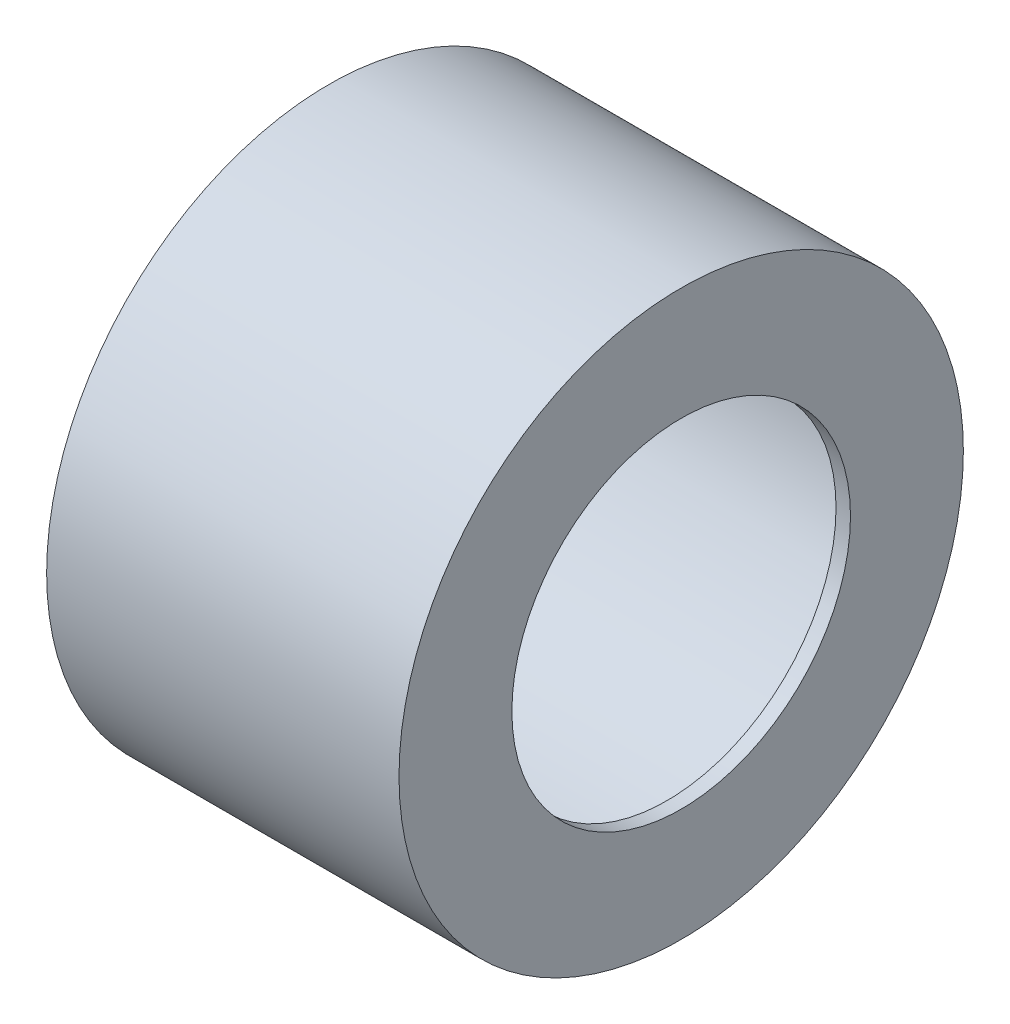
ISO-10303-21;
HEADER;
FILE_DESCRIPTION(('STEP AP214'),'2;1');
FILE_NAME('part.step','',(''),(''),'','','');
FILE_SCHEMA(('AUTOMOTIVE_DESIGN { 1 0 10303 214 1 1 1 1 }'));
ENDSEC;
DATA;
#1=APPLICATION_CONTEXT('core data for automotive mechanical design processes');
#2=APPLICATION_PROTOCOL_DEFINITION('international standard','automotive_design',2000,#1);
#3=PRODUCT_CONTEXT('',#1,'mechanical');
#4=PRODUCT('Part','Part','',(#3));
#5=PRODUCT_RELATED_PRODUCT_CATEGORY('part','',(#4));
#6=PRODUCT_DEFINITION_FORMATION('','',#4);
#7=PRODUCT_DEFINITION_CONTEXT('part definition',#1,'design');
#8=PRODUCT_DEFINITION('design','',#6,#7);
#9=PRODUCT_DEFINITION_SHAPE('','',#8);
#10=(LENGTH_UNIT() NAMED_UNIT(*) SI_UNIT(.MILLI.,.METRE.));
#11=(NAMED_UNIT(*) PLANE_ANGLE_UNIT() SI_UNIT($,.RADIAN.));
#12=(NAMED_UNIT(*) SI_UNIT($,.STERADIAN.) SOLID_ANGLE_UNIT());
#13=UNCERTAINTY_MEASURE_WITH_UNIT(LENGTH_MEASURE(1.E-05),#10,'distance_accuracy_value','');
#14=(GEOMETRIC_REPRESENTATION_CONTEXT(3) GLOBAL_UNCERTAINTY_ASSIGNED_CONTEXT((#13)) GLOBAL_UNIT_ASSIGNED_CONTEXT((#10,
#11,#12)) REPRESENTATION_CONTEXT('',''));
#15=CARTESIAN_POINT('',(0.,0.,0.));
#16=DIRECTION('',(0.,0.,1.));
#17=DIRECTION('',(1.,0.,0.));
#18=AXIS2_PLACEMENT_3D('',#15,#16,#17);
#19=CARTESIAN_POINT('',(135.7,39.,0.));
#20=DIRECTION('',(1.,0.,0.));
#21=DIRECTION('',(0.,0.,-1.));
#22=AXIS2_PLACEMENT_3D('',#19,#20,#21);
#23=PLANE('',#22);
#24=CARTESIAN_POINT('',(135.7,0.,0.));
#25=DIRECTION('',(-1.,0.,0.));
#26=DIRECTION('',(0.,0.,1.));
#27=AXIS2_PLACEMENT_3D('',#24,#25,#26);
#28=CIRCLE('',#27,36.4);
#29=CARTESIAN_POINT('',(135.7,0.,36.4));
#30=VERTEX_POINT('',#29);
#31=EDGE_CURVE('E10',#30,#30,#28,.T.);
#32=ORIENTED_EDGE('',*,*,#31,.F.);
#33=EDGE_LOOP('',(#32));
#34=FACE_BOUND('',#33,.T.);
#35=CARTESIAN_POINT('',(135.7,0.,0.));
#36=DIRECTION('',(-1.,0.,0.));
#37=DIRECTION('',(0.,0.,1.));
#38=AXIS2_PLACEMENT_3D('',#35,#36,#37);
#39=CIRCLE('',#38,39.);
#40=CARTESIAN_POINT('',(135.7,0.,39.));
#41=VERTEX_POINT('',#40);
#42=EDGE_CURVE('E64',#41,#41,#39,.T.);
#43=ORIENTED_EDGE('',*,*,#42,.T.);
#44=EDGE_LOOP('',(#43));
#45=FACE_BOUND('',#44,.T.);
#46=ADVANCED_FACE('F37',(#34,#45),#23,.F.);
#47=CARTESIAN_POINT('',(-110.,0.,0.));
#48=DIRECTION('',(-1.,0.,0.));
#49=DIRECTION('',(0.,0.,1.));
#50=AXIS2_PLACEMENT_3D('',#47,#48,#49);
#51=CYLINDRICAL_SURFACE('',#50,36.4);
#52=CARTESIAN_POINT('',(182.4,0.,0.));
#53=DIRECTION('',(-1.,0.,0.));
#54=DIRECTION('',(0.,0.,1.));
#55=AXIS2_PLACEMENT_3D('',#52,#53,#54);
#56=CIRCLE('',#55,36.4);
#57=CARTESIAN_POINT('',(182.4,0.,36.4));
#58=VERTEX_POINT('',#57);
#59=EDGE_CURVE('E44',#58,#58,#56,.T.);
#60=ORIENTED_EDGE('',*,*,#59,.F.);
#61=EDGE_LOOP('',(#60));
#62=FACE_BOUND('',#61,.T.);
#63=ORIENTED_EDGE('',*,*,#31,.T.);
#64=EDGE_LOOP('',(#63));
#65=FACE_BOUND('',#64,.T.);
#66=ADVANCED_FACE('F90',(#62,#65),#51,.F.);
#67=CARTESIAN_POINT('',(182.4,36.4,0.));
#68=DIRECTION('',(1.,0.,0.));
#69=DIRECTION('',(0.,0.,-1.));
#70=AXIS2_PLACEMENT_3D('',#67,#68,#69);
#71=PLANE('',#70);
#72=CARTESIAN_POINT('',(182.4,0.,0.));
#73=DIRECTION('',(-1.,0.,0.));
#74=DIRECTION('',(0.,0.,1.));
#75=AXIS2_PLACEMENT_3D('',#72,#73,#74);
#76=CIRCLE('',#75,23.4);
#77=CARTESIAN_POINT('',(182.4,0.,23.4));
#78=VERTEX_POINT('',#77);
#79=EDGE_CURVE('E49',#78,#78,#76,.T.);
#80=ORIENTED_EDGE('',*,*,#79,.F.);
#81=EDGE_LOOP('',(#80));
#82=FACE_BOUND('',#81,.T.);
#83=ORIENTED_EDGE('',*,*,#59,.T.);
#84=EDGE_LOOP('',(#83));
#85=FACE_BOUND('',#84,.T.);
#86=ADVANCED_FACE('F85',(#82,#85),#71,.F.);
#87=CARTESIAN_POINT('',(-110.,0.,0.));
#88=DIRECTION('',(-1.,0.,0.));
#89=DIRECTION('',(0.,0.,1.));
#90=AXIS2_PLACEMENT_3D('',#87,#88,#89);
#91=CYLINDRICAL_SURFACE('',#90,23.4);
#92=CARTESIAN_POINT('',(184.4,0.,0.));
#93=DIRECTION('',(-1.,0.,0.));
#94=DIRECTION('',(0.,0.,1.));
#95=AXIS2_PLACEMENT_3D('',#92,#93,#94);
#96=CIRCLE('',#95,23.4);
#97=CARTESIAN_POINT('',(184.4,0.,23.4));
#98=VERTEX_POINT('',#97);
#99=EDGE_CURVE('E54',#98,#98,#96,.T.);
#100=ORIENTED_EDGE('',*,*,#99,.F.);
#101=EDGE_LOOP('',(#100));
#102=FACE_BOUND('',#101,.T.);
#103=ORIENTED_EDGE('',*,*,#79,.T.);
#104=EDGE_LOOP('',(#103));
#105=FACE_BOUND('',#104,.T.);
#106=ADVANCED_FACE('F79',(#102,#105),#91,.F.);
#107=CARTESIAN_POINT('',(184.4,23.4,0.));
#108=DIRECTION('',(-1.,0.,0.));
#109=DIRECTION('',(0.,0.,1.));
#110=AXIS2_PLACEMENT_3D('',#107,#108,#109);
#111=PLANE('',#110);
#112=CARTESIAN_POINT('',(184.4,0.,0.));
#113=DIRECTION('',(-1.,0.,0.));
#114=DIRECTION('',(0.,0.,1.));
#115=AXIS2_PLACEMENT_3D('',#112,#113,#114);
#116=CIRCLE('',#115,39.);
#117=CARTESIAN_POINT('',(184.4,0.,39.));
#118=VERTEX_POINT('',#117);
#119=EDGE_CURVE('E60',#118,#118,#116,.T.);
#120=ORIENTED_EDGE('',*,*,#119,.F.);
#121=EDGE_LOOP('',(#120));
#122=FACE_BOUND('',#121,.T.);
#123=ORIENTED_EDGE('',*,*,#99,.T.);
#124=EDGE_LOOP('',(#123));
#125=FACE_BOUND('',#124,.T.);
#126=ADVANCED_FACE('F73',(#122,#125),#111,.F.);
#127=CARTESIAN_POINT('',(-110.,0.,0.));
#128=DIRECTION('',(-1.,0.,0.));
#129=DIRECTION('',(0.,0.,1.));
#130=AXIS2_PLACEMENT_3D('',#127,#128,#129);
#131=CYLINDRICAL_SURFACE('',#130,39.);
#132=ORIENTED_EDGE('',*,*,#42,.F.);
#133=EDGE_LOOP('',(#132));
#134=FACE_BOUND('',#133,.T.);
#135=ORIENTED_EDGE('',*,*,#119,.T.);
#136=EDGE_LOOP('',(#135));
#137=FACE_BOUND('',#136,.T.);
#138=ADVANCED_FACE('F70',(#134,#137),#131,.T.);
#139=CLOSED_SHELL('',(#46,#66,#86,#106,#126,#138));
#140=MANIFOLD_SOLID_BREP('B2',#139);
#141=ADVANCED_BREP_SHAPE_REPRESENTATION('',(#18,#140),#14);
#142=SHAPE_DEFINITION_REPRESENTATION(#9,#141);
ENDSEC;
END-ISO-10303-21;
